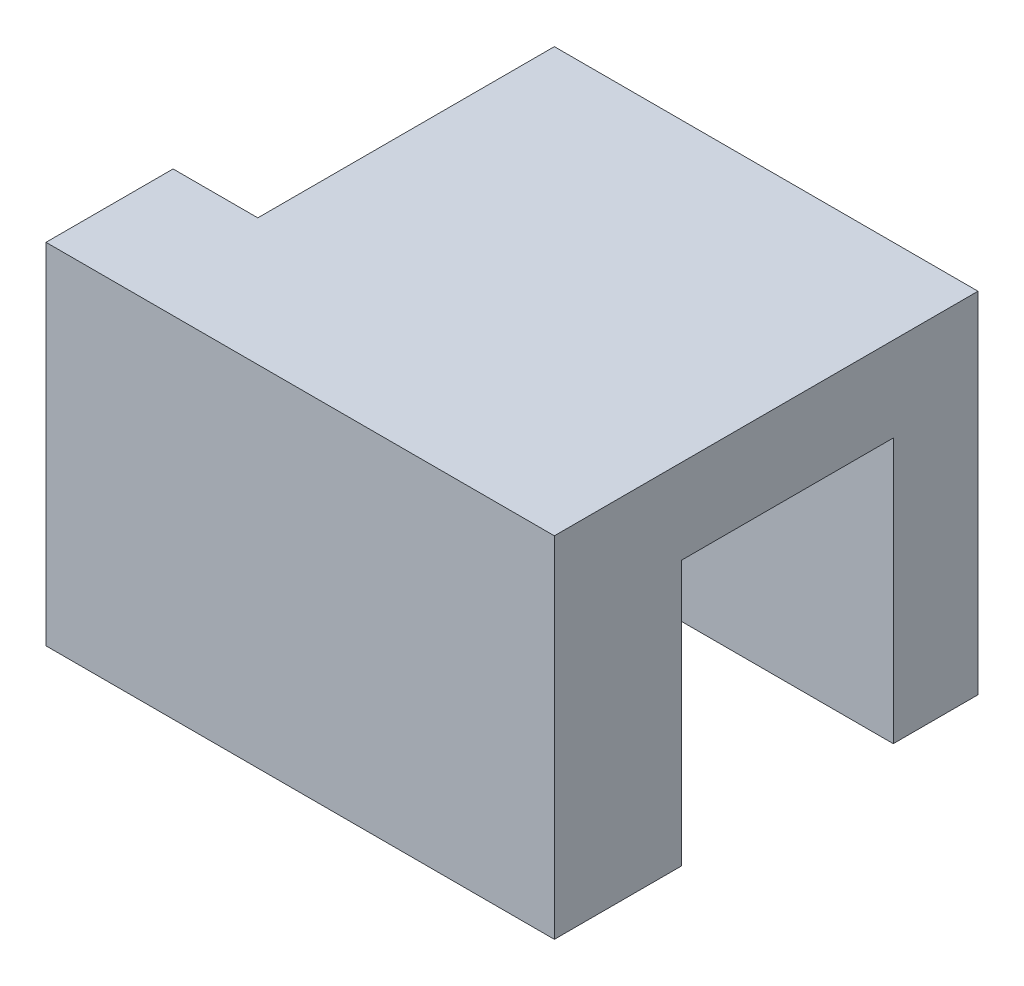
ISO-10303-21;
HEADER;
FILE_DESCRIPTION(('STEP AP214'),'2;1');
FILE_NAME('part.step','',(''),(''),'','','');
FILE_SCHEMA(('AUTOMOTIVE_DESIGN { 1 0 10303 214 1 1 1 1 }'));
ENDSEC;
DATA;
#1=APPLICATION_CONTEXT('core data for automotive mechanical design processes');
#2=APPLICATION_PROTOCOL_DEFINITION('international standard','automotive_design',2000,#1);
#3=PRODUCT_CONTEXT('',#1,'mechanical');
#4=PRODUCT('Part','Part','',(#3));
#5=PRODUCT_RELATED_PRODUCT_CATEGORY('part','',(#4));
#6=PRODUCT_DEFINITION_FORMATION('','',#4);
#7=PRODUCT_DEFINITION_CONTEXT('part definition',#1,'design');
#8=PRODUCT_DEFINITION('design','',#6,#7);
#9=PRODUCT_DEFINITION_SHAPE('','',#8);
#10=(LENGTH_UNIT() NAMED_UNIT(*) SI_UNIT(.MILLI.,.METRE.));
#11=(NAMED_UNIT(*) PLANE_ANGLE_UNIT() SI_UNIT($,.RADIAN.));
#12=(NAMED_UNIT(*) SI_UNIT($,.STERADIAN.) SOLID_ANGLE_UNIT());
#13=UNCERTAINTY_MEASURE_WITH_UNIT(LENGTH_MEASURE(1.E-05),#10,'distance_accuracy_value','');
#14=(GEOMETRIC_REPRESENTATION_CONTEXT(3) GLOBAL_UNCERTAINTY_ASSIGNED_CONTEXT((#13)) GLOBAL_UNIT_ASSIGNED_CONTEXT((#10,
#11,#12)) REPRESENTATION_CONTEXT('',''));
#15=CARTESIAN_POINT('',(0.,0.,0.));
#16=DIRECTION('',(0.,0.,1.));
#17=DIRECTION('',(1.,0.,0.));
#18=AXIS2_PLACEMENT_3D('',#15,#16,#17);
#19=CARTESIAN_POINT('',(-5.56451612903226,12.5,-3.29516129032258));
#20=DIRECTION('',(1.,0.,0.));
#21=DIRECTION('',(0.,0.,-1.));
#22=AXIS2_PLACEMENT_3D('',#19,#20,#21);
#23=PLANE('',#22);
#24=DIRECTION('',(0.,-0.707106781186546,-0.707106781186549));
#25=VECTOR('',#24,1.);
#26=CARTESIAN_POINT('',(-5.56451612903226,7.5,0.543673474509288));
#27=LINE('',#26,#25);
#28=CARTESIAN_POINT('',(-5.56451612903226,7.5,0.543673474509288));
#29=VERTEX_POINT('',#28);
#30=CARTESIAN_POINT('',(-5.56451612903226,3.66116523516814,-3.29516129032258));
#31=VERTEX_POINT('',#30);
#32=EDGE_CURVE('E47',#29,#31,#27,.T.);
#33=ORIENTED_EDGE('',*,*,#32,.F.);
#34=DIRECTION('',(0.,-0.707106781186546,0.707106781186548));
#35=VECTOR('',#34,1.);
#36=CARTESIAN_POINT('',(-5.56451612903226,11.3388347648319,-3.29516129032258));
#37=LINE('',#36,#35);
#38=CARTESIAN_POINT('',(-5.56451612903226,11.3388347648319,-3.29516129032258));
#39=VERTEX_POINT('',#38);
#40=EDGE_CURVE('E146',#39,#29,#37,.T.);
#41=ORIENTED_EDGE('',*,*,#40,.F.);
#42=DIRECTION('',(0.,-1.,0.));
#43=VECTOR('',#42,1.);
#44=CARTESIAN_POINT('',(-5.56451612903226,12.5,-3.29516129032258));
#45=LINE('',#44,#43);
#46=EDGE_CURVE('E51',#39,#31,#45,.T.);
#47=ORIENTED_EDGE('',*,*,#46,.T.);
#48=EDGE_LOOP('',(#33,#41,#47));
#49=FACE_BOUND('',#48,.T.);
#50=ADVANCED_FACE('F33',(#49),#23,.F.);
#51=DIRECTION('',(0.,-1.,0.));
#52=VECTOR('',#51,1.);
#53=CARTESIAN_POINT('',(-5.56451612903226,16.5,-3.29516129032261));
#54=LINE('',#53,#52);
#55=CARTESIAN_POINT('',(-5.56451612903226,16.5,-3.2951612903226));
#56=VERTEX_POINT('',#55);
#57=CARTESIAN_POINT('',(-5.56451612903226,12.5,-3.29516129032258));
#58=VERTEX_POINT('',#57);
#59=EDGE_CURVE('E158',#56,#58,#54,.T.);
#60=ORIENTED_EDGE('',*,*,#59,.F.);
#61=DIRECTION('',(0.,0.,1.));
#62=VECTOR('',#61,1.);
#63=CARTESIAN_POINT('',(-5.56451612903226,16.5,2.70483870967743));
#64=LINE('',#63,#62);
#65=CARTESIAN_POINT('',(-5.56451612903227,16.5,-17.2951612903226));
#66=VERTEX_POINT('',#65);
#67=EDGE_CURVE('E184',#66,#56,#64,.T.);
#68=ORIENTED_EDGE('',*,*,#67,.F.);
#69=DIRECTION('',(0.,1.,0.));
#70=VECTOR('',#69,1.);
#71=CARTESIAN_POINT('',(-5.56451612903227,12.5,-17.2951612903226));
#72=LINE('',#71,#70);
#73=CARTESIAN_POINT('',(-5.56451612903227,0.,-17.2951612903226));
#74=VERTEX_POINT('',#73);
#75=EDGE_CURVE('E182',#74,#66,#72,.T.);
#76=ORIENTED_EDGE('',*,*,#75,.F.);
#77=DIRECTION('',(0.,0.,-1.));
#78=VECTOR('',#77,1.);
#79=CARTESIAN_POINT('',(-5.56451612903227,0.,-17.2951612903226));
#80=LINE('',#79,#78);
#81=CARTESIAN_POINT('',(-5.56451612903227,0.,-13.2951612903226));
#82=VERTEX_POINT('',#81);
#83=EDGE_CURVE('E179',#82,#74,#80,.T.);
#84=ORIENTED_EDGE('',*,*,#83,.F.);
#85=DIRECTION('',(0.,-1.,0.));
#86=VECTOR('',#85,1.);
#87=CARTESIAN_POINT('',(-5.56451612903227,12.5,-13.2951612903226));
#88=LINE('',#87,#86);
#89=CARTESIAN_POINT('',(-5.56451612903227,12.5,-13.2951612903226));
#90=VERTEX_POINT('',#89);
#91=EDGE_CURVE('E175',#90,#82,#88,.T.);
#92=ORIENTED_EDGE('',*,*,#91,.F.);
#93=DIRECTION('',(0.,0.,-1.));
#94=VECTOR('',#93,1.);
#95=CARTESIAN_POINT('',(-5.56451612903226,12.5,2.70483870967743));
#96=LINE('',#95,#94);
#97=EDGE_CURVE('E173',#58,#90,#96,.T.);
#98=ORIENTED_EDGE('',*,*,#97,.F.);
#99=EDGE_LOOP('',(#60,#68,#76,#84,#92,#98));
#100=FACE_BOUND('',#99,.T.);
#101=ADVANCED_FACE('F244',(#100),#23,.F.);
#102=CARTESIAN_POINT('',(-5.56451612903226,12.5,2.70483870967742));
#103=DIRECTION('',(0.,0.,-1.));
#104=DIRECTION('',(-1.,0.,0.));
#105=AXIS2_PLACEMENT_3D('',#102,#103,#104);
#106=PLANE('',#105);
#107=DIRECTION('',(1.,0.,0.));
#108=VECTOR('',#107,1.);
#109=CARTESIAN_POINT('',(-5.56451612903226,0.,2.70483870967742));
#110=LINE('',#109,#108);
#111=CARTESIAN_POINT('',(-9.56451612903226,0.,2.70483870967742));
#112=VERTEX_POINT('',#111);
#113=CARTESIAN_POINT('',(14.4354838709677,0.,2.70483870967742));
#114=VERTEX_POINT('',#113);
#115=EDGE_CURVE('E135',#112,#114,#110,.T.);
#116=ORIENTED_EDGE('',*,*,#115,.T.);
#117=DIRECTION('',(0.,-1.,0.));
#118=VECTOR('',#117,1.);
#119=CARTESIAN_POINT('',(14.4354838709677,12.5,2.70483870967742));
#120=LINE('',#119,#118);
#121=CARTESIAN_POINT('',(14.4354838709677,16.5,2.70483870967742));
#122=VERTEX_POINT('',#121);
#123=EDGE_CURVE('E11',#122,#114,#120,.T.);
#124=ORIENTED_EDGE('',*,*,#123,.F.);
#125=DIRECTION('',(1.,0.,0.));
#126=VECTOR('',#125,1.);
#127=CARTESIAN_POINT('',(-5.56451612903226,16.5,2.70483870967743));
#128=LINE('',#127,#126);
#129=CARTESIAN_POINT('',(-9.56451612903226,16.5,2.70483870967743));
#130=VERTEX_POINT('',#129);
#131=EDGE_CURVE('E200',#130,#122,#128,.T.);
#132=ORIENTED_EDGE('',*,*,#131,.F.);
#133=DIRECTION('',(0.,1.,0.));
#134=VECTOR('',#133,1.);
#135=CARTESIAN_POINT('',(-9.56451612903226,0.,2.70483870967742));
#136=LINE('',#135,#134);
#137=EDGE_CURVE('E139',#112,#130,#136,.T.);
#138=ORIENTED_EDGE('',*,*,#137,.F.);
#139=EDGE_LOOP('',(#116,#124,#132,#138));
#140=FACE_BOUND('',#139,.T.);
#141=ADVANCED_FACE('F220',(#140),#106,.F.);
#142=CARTESIAN_POINT('',(14.4354838709677,12.5,-3.29516129032258));
#143=DIRECTION('',(-1.,0.,0.));
#144=DIRECTION('',(0.,0.,1.));
#145=AXIS2_PLACEMENT_3D('',#142,#143,#144);
#146=PLANE('',#145);
#147=DIRECTION('',(0.,0.,-1.));
#148=VECTOR('',#147,1.);
#149=CARTESIAN_POINT('',(14.4354838709677,0.,-3.29516129032258));
#150=LINE('',#149,#148);
#151=CARTESIAN_POINT('',(14.4354838709677,0.,-3.29516129032258));
#152=VERTEX_POINT('',#151);
#153=EDGE_CURVE('E130',#114,#152,#150,.T.);
#154=ORIENTED_EDGE('',*,*,#153,.T.);
#155=DIRECTION('',(0.,-1.,0.));
#156=VECTOR('',#155,1.);
#157=CARTESIAN_POINT('',(14.4354838709677,12.5,-3.29516129032258));
#158=LINE('',#157,#156);
#159=CARTESIAN_POINT('',(14.4354838709677,12.5,-3.29516129032258));
#160=VERTEX_POINT('',#159);
#161=EDGE_CURVE('E40',#160,#152,#158,.T.);
#162=ORIENTED_EDGE('',*,*,#161,.F.);
#163=DIRECTION('',(0.,0.,-1.));
#164=VECTOR('',#163,1.);
#165=CARTESIAN_POINT('',(14.4354838709677,12.5,2.70483870967742));
#166=LINE('',#165,#164);
#167=CARTESIAN_POINT('',(14.4354838709677,12.5,-13.2951612903226));
#168=VERTEX_POINT('',#167);
#169=EDGE_CURVE('E172',#160,#168,#166,.T.);
#170=ORIENTED_EDGE('',*,*,#169,.T.);
#171=DIRECTION('',(0.,-1.,0.));
#172=VECTOR('',#171,1.);
#173=CARTESIAN_POINT('',(14.4354838709677,12.5,-13.2951612903226));
#174=LINE('',#173,#172);
#175=CARTESIAN_POINT('',(14.4354838709677,0.,-13.2951612903226));
#176=VERTEX_POINT('',#175);
#177=EDGE_CURVE('E189',#168,#176,#174,.T.);
#178=ORIENTED_EDGE('',*,*,#177,.T.);
#179=DIRECTION('',(0.,0.,-1.));
#180=VECTOR('',#179,1.);
#181=CARTESIAN_POINT('',(14.4354838709677,0.,-17.2951612903226));
#182=LINE('',#181,#180);
#183=CARTESIAN_POINT('',(14.4354838709677,0.,-17.2951612903226));
#184=VERTEX_POINT('',#183);
#185=EDGE_CURVE('E192',#176,#184,#182,.T.);
#186=ORIENTED_EDGE('',*,*,#185,.T.);
#187=DIRECTION('',(0.,1.,0.));
#188=VECTOR('',#187,1.);
#189=CARTESIAN_POINT('',(14.4354838709677,12.5,-17.2951612903226));
#190=LINE('',#189,#188);
#191=CARTESIAN_POINT('',(14.4354838709677,16.5,-17.2951612903226));
#192=VERTEX_POINT('',#191);
#193=EDGE_CURVE('E195',#184,#192,#190,.T.);
#194=ORIENTED_EDGE('',*,*,#193,.T.);
#195=DIRECTION('',(0.,0.,1.));
#196=VECTOR('',#195,1.);
#197=CARTESIAN_POINT('',(14.4354838709677,16.5,2.70483870967742));
#198=LINE('',#197,#196);
#199=EDGE_CURVE('E176',#192,#122,#198,.T.);
#200=ORIENTED_EDGE('',*,*,#199,.T.);
#201=ORIENTED_EDGE('',*,*,#123,.T.);
#202=EDGE_LOOP('',(#154,#162,#170,#178,#186,#194,#200,#201));
#203=FACE_BOUND('',#202,.T.);
#204=ADVANCED_FACE('F216',(#203),#146,.F.);
#205=CARTESIAN_POINT('',(-5.56451612903226,12.5,-3.29516129032258));
#206=DIRECTION('',(0.,0.,1.));
#207=DIRECTION('',(1.,0.,0.));
#208=AXIS2_PLACEMENT_3D('',#205,#206,#207);
#209=PLANE('',#208);
#210=DIRECTION('',(-1.,0.,0.));
#211=VECTOR('',#210,1.);
#212=CARTESIAN_POINT('',(-5.56451612903226,0.,-3.29516129032258));
#213=LINE('',#212,#211);
#214=CARTESIAN_POINT('',(-9.56451612903226,0.,-3.29516129032258));
#215=VERTEX_POINT('',#214);
#216=EDGE_CURVE('E119',#152,#215,#213,.T.);
#217=ORIENTED_EDGE('',*,*,#216,.T.);
#218=DIRECTION('',(0.,-1.,0.));
#219=VECTOR('',#218,1.);
#220=CARTESIAN_POINT('',(-9.56451612903226,3.66116523516814,-3.29516129032258));
#221=LINE('',#220,#219);
#222=CARTESIAN_POINT('',(-9.56451612903226,3.66116523516814,-3.29516129032258));
#223=VERTEX_POINT('',#222);
#224=EDGE_CURVE('E124',#223,#215,#221,.T.);
#225=ORIENTED_EDGE('',*,*,#224,.F.);
#226=DIRECTION('',(1.,0.,0.));
#227=VECTOR('',#226,1.);
#228=CARTESIAN_POINT('',(-9.56451612903226,3.66116523516814,-3.29516129032258));
#229=LINE('',#228,#227);
#230=EDGE_CURVE('E157',#223,#31,#229,.T.);
#231=ORIENTED_EDGE('',*,*,#230,.T.);
#232=ORIENTED_EDGE('',*,*,#46,.F.);
#233=DIRECTION('',(1.,0.,0.));
#234=VECTOR('',#233,1.);
#235=CARTESIAN_POINT('',(-9.56451612903226,11.3388347648319,-3.29516129032258));
#236=LINE('',#235,#234);
#237=CARTESIAN_POINT('',(-9.56451612903226,11.3388347648319,-3.29516129032258));
#238=VERTEX_POINT('',#237);
#239=EDGE_CURVE('E166',#238,#39,#236,.T.);
#240=ORIENTED_EDGE('',*,*,#239,.F.);
#241=DIRECTION('',(0.,-1.,0.));
#242=VECTOR('',#241,1.);
#243=CARTESIAN_POINT('',(-9.56451612903226,16.5,-3.29516129032261));
#244=LINE('',#243,#242);
#245=CARTESIAN_POINT('',(-9.56451612903226,16.5,-3.29516129032261));
#246=VERTEX_POINT('',#245);
#247=EDGE_CURVE('E152',#246,#238,#244,.T.);
#248=ORIENTED_EDGE('',*,*,#247,.F.);
#249=DIRECTION('',(1.,0.,0.));
#250=VECTOR('',#249,1.);
#251=CARTESIAN_POINT('',(-9.56451612903226,16.5,-3.29516129032261));
#252=LINE('',#251,#250);
#253=EDGE_CURVE('E169',#246,#56,#252,.T.);
#254=ORIENTED_EDGE('',*,*,#253,.T.);
#255=ORIENTED_EDGE('',*,*,#59,.T.);
#256=DIRECTION('',(-1.,0.,0.));
#257=VECTOR('',#256,1.);
#258=CARTESIAN_POINT('',(-2.56451612903226,12.5,-3.29516129032258));
#259=LINE('',#258,#257);
#260=EDGE_CURVE('E129',#160,#58,#259,.T.);
#261=ORIENTED_EDGE('',*,*,#260,.F.);
#262=ORIENTED_EDGE('',*,*,#161,.T.);
#263=EDGE_LOOP('',(#217,#225,#231,#232,#240,#248,#254,#255,#261,#262));
#264=FACE_BOUND('',#263,.T.);
#265=ADVANCED_FACE('F121',(#264),#209,.F.);
#266=CARTESIAN_POINT('',(0.,0.,0.));
#267=DIRECTION('',(0.,1.,0.));
#268=DIRECTION('',(0.,0.,1.));
#269=AXIS2_PLACEMENT_3D('',#266,#267,#268);
#270=PLANE('',#269);
#271=ORIENTED_EDGE('',*,*,#115,.F.);
#272=DIRECTION('',(0.,0.,1.));
#273=VECTOR('',#272,1.);
#274=CARTESIAN_POINT('',(-9.56451612903226,0.,-3.29516129032258));
#275=LINE('',#274,#273);
#276=EDGE_CURVE('E133',#215,#112,#275,.T.);
#277=ORIENTED_EDGE('',*,*,#276,.F.);
#278=ORIENTED_EDGE('',*,*,#216,.F.);
#279=ORIENTED_EDGE('',*,*,#153,.F.);
#280=EDGE_LOOP('',(#271,#277,#278,#279));
#281=FACE_BOUND('',#280,.T.);
#282=ADVANCED_FACE('F134',(#281),#270,.F.);
#283=CARTESIAN_POINT('',(-5.56451612903226,12.5,2.70483870967743));
#284=DIRECTION('',(0.,-1.,0.));
#285=DIRECTION('',(0.,0.,-1.));
#286=AXIS2_PLACEMENT_3D('',#283,#284,#285);
#287=PLANE('',#286);
#288=ORIENTED_EDGE('',*,*,#260,.T.);
#289=ORIENTED_EDGE('',*,*,#97,.T.);
#290=DIRECTION('',(1.,0.,0.));
#291=VECTOR('',#290,1.);
#292=CARTESIAN_POINT('',(-5.56451612903227,12.5,-13.2951612903226));
#293=LINE('',#292,#291);
#294=EDGE_CURVE('E187',#90,#168,#293,.T.);
#295=ORIENTED_EDGE('',*,*,#294,.T.);
#296=ORIENTED_EDGE('',*,*,#169,.F.);
#297=EDGE_LOOP('',(#288,#289,#295,#296));
#298=FACE_BOUND('',#297,.T.);
#299=ADVANCED_FACE('F266',(#298),#287,.T.);
#300=CARTESIAN_POINT('',(-5.56451612903226,16.5,2.70483870967743));
#301=DIRECTION('',(0.,1.,0.));
#302=DIRECTION('',(0.,0.,1.));
#303=AXIS2_PLACEMENT_3D('',#300,#301,#302);
#304=PLANE('',#303);
#305=ORIENTED_EDGE('',*,*,#199,.F.);
#306=DIRECTION('',(1.,0.,0.));
#307=VECTOR('',#306,1.);
#308=CARTESIAN_POINT('',(-5.56451612903227,16.5,-17.2951612903226));
#309=LINE('',#308,#307);
#310=EDGE_CURVE('E203',#66,#192,#309,.T.);
#311=ORIENTED_EDGE('',*,*,#310,.F.);
#312=ORIENTED_EDGE('',*,*,#67,.T.);
#313=ORIENTED_EDGE('',*,*,#253,.F.);
#314=DIRECTION('',(0.,0.,-1.));
#315=VECTOR('',#314,1.);
#316=CARTESIAN_POINT('',(-9.56451612903226,16.5,2.70483870967743));
#317=LINE('',#316,#315);
#318=EDGE_CURVE('E150',#130,#246,#317,.T.);
#319=ORIENTED_EDGE('',*,*,#318,.F.);
#320=ORIENTED_EDGE('',*,*,#131,.T.);
#321=EDGE_LOOP('',(#305,#311,#312,#313,#319,#320));
#322=FACE_BOUND('',#321,.T.);
#323=ADVANCED_FACE('F223',(#322),#304,.T.);
#324=CARTESIAN_POINT('',(-5.56451612903227,12.5,-17.2951612903226));
#325=DIRECTION('',(0.,0.,-1.));
#326=DIRECTION('',(-1.,0.,0.));
#327=AXIS2_PLACEMENT_3D('',#324,#325,#326);
#328=PLANE('',#327);
#329=ORIENTED_EDGE('',*,*,#193,.F.);
#330=DIRECTION('',(1.,0.,0.));
#331=VECTOR('',#330,1.);
#332=CARTESIAN_POINT('',(-5.56451612903227,0.,-17.2951612903226));
#333=LINE('',#332,#331);
#334=EDGE_CURVE('E205',#74,#184,#333,.T.);
#335=ORIENTED_EDGE('',*,*,#334,.F.);
#336=ORIENTED_EDGE('',*,*,#75,.T.);
#337=ORIENTED_EDGE('',*,*,#310,.T.);
#338=EDGE_LOOP('',(#329,#335,#336,#337));
#339=FACE_BOUND('',#338,.T.);
#340=ADVANCED_FACE('F257',(#339),#328,.T.);
#341=CARTESIAN_POINT('',(-5.56451612903227,0.,-17.2951612903226));
#342=DIRECTION('',(0.,-1.,0.));
#343=DIRECTION('',(0.,0.,-1.));
#344=AXIS2_PLACEMENT_3D('',#341,#342,#343);
#345=PLANE('',#344);
#346=ORIENTED_EDGE('',*,*,#185,.F.);
#347=DIRECTION('',(1.,0.,0.));
#348=VECTOR('',#347,1.);
#349=CARTESIAN_POINT('',(-5.56451612903227,0.,-13.2951612903226));
#350=LINE('',#349,#348);
#351=EDGE_CURVE('E208',#82,#176,#350,.T.);
#352=ORIENTED_EDGE('',*,*,#351,.F.);
#353=ORIENTED_EDGE('',*,*,#83,.T.);
#354=ORIENTED_EDGE('',*,*,#334,.T.);
#355=EDGE_LOOP('',(#346,#352,#353,#354));
#356=FACE_BOUND('',#355,.T.);
#357=ADVANCED_FACE('F261',(#356),#345,.T.);
#358=CARTESIAN_POINT('',(-5.56451612903227,12.5,-13.2951612903226));
#359=DIRECTION('',(0.,0.,1.));
#360=DIRECTION('',(1.,0.,0.));
#361=AXIS2_PLACEMENT_3D('',#358,#359,#360);
#362=PLANE('',#361);
#363=ORIENTED_EDGE('',*,*,#177,.F.);
#364=ORIENTED_EDGE('',*,*,#294,.F.);
#365=ORIENTED_EDGE('',*,*,#91,.T.);
#366=ORIENTED_EDGE('',*,*,#351,.T.);
#367=EDGE_LOOP('',(#363,#364,#365,#366));
#368=FACE_BOUND('',#367,.T.);
#369=ADVANCED_FACE('F241',(#368),#362,.T.);
#370=CARTESIAN_POINT('',(-9.56451612903226,11.3388347648319,-3.29516129032258));
#371=DIRECTION('',(0.,0.707106781186549,0.707106781186547));
#372=DIRECTION('',(0.,-0.707106781186546,0.707106781186549));
#373=AXIS2_PLACEMENT_3D('',#370,#371,#372);
#374=PLANE('',#373);
#375=ORIENTED_EDGE('',*,*,#40,.T.);
#376=DIRECTION('',(1.,0.,0.));
#377=VECTOR('',#376,1.);
#378=CARTESIAN_POINT('',(-9.56451612903226,7.5,0.543673474509289));
#379=LINE('',#378,#377);
#380=CARTESIAN_POINT('',(-9.56451612903226,7.5,0.543673474509289));
#381=VERTEX_POINT('',#380);
#382=EDGE_CURVE('E163',#381,#29,#379,.T.);
#383=ORIENTED_EDGE('',*,*,#382,.F.);
#384=DIRECTION('',(0.,-0.707106781186546,0.707106781186548));
#385=VECTOR('',#384,1.);
#386=CARTESIAN_POINT('',(-9.56451612903226,11.3388347648319,-3.29516129032258));
#387=LINE('',#386,#385);
#388=EDGE_CURVE('E154',#238,#381,#387,.T.);
#389=ORIENTED_EDGE('',*,*,#388,.F.);
#390=ORIENTED_EDGE('',*,*,#239,.T.);
#391=EDGE_LOOP('',(#375,#383,#389,#390));
#392=FACE_BOUND('',#391,.T.);
#393=ADVANCED_FACE('F231',(#392),#374,.F.);
#394=CARTESIAN_POINT('',(-9.56451612903226,7.5,0.543673474509289));
#395=DIRECTION('',(0.,-0.707106781186549,0.707106781186546));
#396=DIRECTION('',(0.,-0.707106781186546,-0.707106781186549));
#397=AXIS2_PLACEMENT_3D('',#394,#395,#396);
#398=PLANE('',#397);
#399=ORIENTED_EDGE('',*,*,#32,.T.);
#400=ORIENTED_EDGE('',*,*,#230,.F.);
#401=DIRECTION('',(0.,-0.707106781186546,-0.707106781186549));
#402=VECTOR('',#401,1.);
#403=CARTESIAN_POINT('',(-9.56451612903226,7.5,0.543673474509289));
#404=LINE('',#403,#402);
#405=EDGE_CURVE('E143',#381,#223,#404,.T.);
#406=ORIENTED_EDGE('',*,*,#405,.F.);
#407=ORIENTED_EDGE('',*,*,#382,.T.);
#408=EDGE_LOOP('',(#399,#400,#406,#407));
#409=FACE_BOUND('',#408,.T.);
#410=ADVANCED_FACE('F233',(#409),#398,.F.);
#411=CARTESIAN_POINT('',(-9.56451612903226,0.,0.));
#412=DIRECTION('',(-1.,0.,0.));
#413=DIRECTION('',(0.,0.,1.));
#414=AXIS2_PLACEMENT_3D('',#411,#412,#413);
#415=PLANE('',#414);
#416=ORIENTED_EDGE('',*,*,#224,.T.);
#417=ORIENTED_EDGE('',*,*,#276,.T.);
#418=ORIENTED_EDGE('',*,*,#137,.T.);
#419=ORIENTED_EDGE('',*,*,#318,.T.);
#420=ORIENTED_EDGE('',*,*,#247,.T.);
#421=ORIENTED_EDGE('',*,*,#388,.T.);
#422=ORIENTED_EDGE('',*,*,#405,.T.);
#423=EDGE_LOOP('',(#416,#417,#418,#419,#420,#421,#422));
#424=FACE_BOUND('',#423,.T.);
#425=ADVANCED_FACE('F141',(#424),#415,.T.);
#426=CLOSED_SHELL('',(#50,#101,#141,#204,#265,#282,#299,#323,#340,#357,#369,#393,#410,#425));
#427=MANIFOLD_SOLID_BREP('B2',#426);
#428=ADVANCED_BREP_SHAPE_REPRESENTATION('',(#18,#427),#14);
#429=SHAPE_DEFINITION_REPRESENTATION(#9,#428);
ENDSEC;
END-ISO-10303-21;
